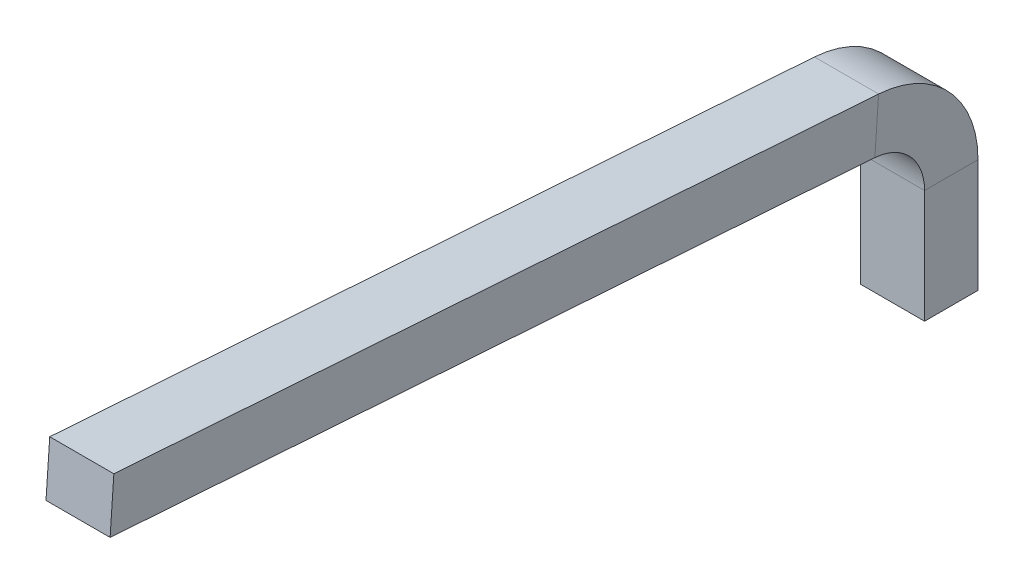
ISO-10303-21;
HEADER;
FILE_DESCRIPTION(('STEP AP214'),'2;1');
FILE_NAME('part.step','',(''),(''),'','','');
FILE_SCHEMA(('AUTOMOTIVE_DESIGN { 1 0 10303 214 1 1 1 1 }'));
ENDSEC;
DATA;
#1=APPLICATION_CONTEXT('core data for automotive mechanical design processes');
#2=APPLICATION_PROTOCOL_DEFINITION('international standard','automotive_design',2000,#1);
#3=PRODUCT_CONTEXT('',#1,'mechanical');
#4=PRODUCT('Part','Part','',(#3));
#5=PRODUCT_RELATED_PRODUCT_CATEGORY('part','',(#4));
#6=PRODUCT_DEFINITION_FORMATION('','',#4);
#7=PRODUCT_DEFINITION_CONTEXT('part definition',#1,'design');
#8=PRODUCT_DEFINITION('design','',#6,#7);
#9=PRODUCT_DEFINITION_SHAPE('','',#8);
#10=(LENGTH_UNIT() NAMED_UNIT(*) SI_UNIT(.MILLI.,.METRE.));
#11=(NAMED_UNIT(*) PLANE_ANGLE_UNIT() SI_UNIT($,.RADIAN.));
#12=(NAMED_UNIT(*) SI_UNIT($,.STERADIAN.) SOLID_ANGLE_UNIT());
#13=UNCERTAINTY_MEASURE_WITH_UNIT(LENGTH_MEASURE(1.E-05),#10,'distance_accuracy_value','');
#14=(GEOMETRIC_REPRESENTATION_CONTEXT(3) GLOBAL_UNCERTAINTY_ASSIGNED_CONTEXT((#13)) GLOBAL_UNIT_ASSIGNED_CONTEXT((#10,
#11,#12)) REPRESENTATION_CONTEXT('',''));
#15=CARTESIAN_POINT('',(0.,0.,0.));
#16=DIRECTION('',(0.,0.,1.));
#17=DIRECTION('',(1.,0.,0.));
#18=AXIS2_PLACEMENT_3D('',#15,#16,#17);
#19=CARTESIAN_POINT('',(0.,0.,0.5));
#20=DIRECTION('',(0.,0.,1.));
#21=DIRECTION('',(1.,0.,0.));
#22=AXIS2_PLACEMENT_3D('',#19,#20,#21);
#23=PLANE('',#22);
#24=DIRECTION('',(0.,-1.,0.));
#25=VECTOR('',#24,1.);
#26=CARTESIAN_POINT('',(3.5997003916458,0.,0.5));
#27=LINE('',#26,#25);
#28=CARTESIAN_POINT('',(3.5997003916458,21.5182796564353,0.5));
#29=VERTEX_POINT('',#28);
#30=CARTESIAN_POINT('',(3.5997003916458,20.4586796564352,0.5));
#31=VERTEX_POINT('',#30);
#32=EDGE_CURVE('E11',#29,#31,#27,.T.);
#33=ORIENTED_EDGE('',*,*,#32,.T.);
#34=DIRECTION('',(1.,0.,0.));
#35=VECTOR('',#34,1.);
#36=CARTESIAN_POINT('',(0.,20.4586796564352,0.5));
#37=LINE('',#36,#35);
#38=CARTESIAN_POINT('',(4.1997003916363,20.4586796564352,0.5));
#39=VERTEX_POINT('',#38);
#40=EDGE_CURVE('E24',#31,#39,#37,.T.);
#41=ORIENTED_EDGE('',*,*,#40,.T.);
#42=DIRECTION('',(0.,1.,0.));
#43=VECTOR('',#42,1.);
#44=CARTESIAN_POINT('',(4.1997003916363,0.,0.5));
#45=LINE('',#44,#43);
#46=CARTESIAN_POINT('',(4.1997003916363,21.5182796564353,0.5));
#47=VERTEX_POINT('',#46);
#48=EDGE_CURVE('E144',#39,#47,#45,.T.);
#49=ORIENTED_EDGE('',*,*,#48,.T.);
#50=DIRECTION('',(-1.,0.,0.));
#51=VECTOR('',#50,1.);
#52=CARTESIAN_POINT('',(0.,21.5182796564353,0.5));
#53=LINE('',#52,#51);
#54=EDGE_CURVE('E142',#47,#29,#53,.T.);
#55=ORIENTED_EDGE('',*,*,#54,.T.);
#56=EDGE_LOOP('',(#33,#41,#49,#55));
#57=FACE_BOUND('',#56,.T.);
#58=ADVANCED_FACE('F17',(#57),#23,.T.);
#59=CARTESIAN_POINT('',(3.5997003916458,0.,0.5));
#60=DIRECTION('',(1.,0.,0.));
#61=DIRECTION('',(0.,1.,0.));
#62=AXIS2_PLACEMENT_3D('',#59,#60,#61);
#63=PLANE('',#62);
#64=DIRECTION('',(0.,0.,-1.));
#65=VECTOR('',#64,1.);
#66=CARTESIAN_POINT('',(3.5997003916458,20.4586796564352,0.5));
#67=LINE('',#66,#65);
#68=CARTESIAN_POINT('',(3.5997003916458,20.4586796564352,0.));
#69=VERTEX_POINT('',#68);
#70=EDGE_CURVE('E140',#31,#69,#67,.T.);
#71=ORIENTED_EDGE('',*,*,#70,.F.);
#72=ORIENTED_EDGE('',*,*,#32,.F.);
#73=DIRECTION('',(0.,0.,1.));
#74=VECTOR('',#73,1.);
#75=CARTESIAN_POINT('',(3.5997003916458,21.5182796564353,0.50000000000015));
#76=LINE('',#75,#74);
#77=CARTESIAN_POINT('',(3.5997003916458,21.5182796564353,0.));
#78=VERTEX_POINT('',#77);
#79=EDGE_CURVE('E137',#78,#29,#76,.T.);
#80=ORIENTED_EDGE('',*,*,#79,.F.);
#81=DIRECTION('',(0.,-1.,0.));
#82=VECTOR('',#81,1.);
#83=CARTESIAN_POINT('',(3.5997003916458,0.,0.));
#84=LINE('',#83,#82);
#85=EDGE_CURVE('E134',#78,#69,#84,.T.);
#86=ORIENTED_EDGE('',*,*,#85,.T.);
#87=EDGE_LOOP('',(#71,#72,#80,#86));
#88=FACE_BOUND('',#87,.T.);
#89=ADVANCED_FACE('F182',(#88),#63,.F.);
#90=CARTESIAN_POINT('',(0.,0.,0.));
#91=DIRECTION('',(0.,0.,1.));
#92=DIRECTION('',(1.,0.,0.));
#93=AXIS2_PLACEMENT_3D('',#90,#91,#92);
#94=PLANE('',#93);
#95=DIRECTION('',(1.,0.,0.));
#96=VECTOR('',#95,1.);
#97=CARTESIAN_POINT('',(0.,20.4586796564352,0.));
#98=LINE('',#97,#96);
#99=CARTESIAN_POINT('',(4.1997003916363,20.4586796564352,0.));
#100=VERTEX_POINT('',#99);
#101=EDGE_CURVE('E132',#69,#100,#98,.T.);
#102=ORIENTED_EDGE('',*,*,#101,.F.);
#103=ORIENTED_EDGE('',*,*,#85,.F.);
#104=DIRECTION('',(-1.,0.,0.));
#105=VECTOR('',#104,1.);
#106=CARTESIAN_POINT('',(0.,21.5182796564353,0.));
#107=LINE('',#106,#105);
#108=CARTESIAN_POINT('',(4.1997003916363,21.5182796564353,0.));
#109=VERTEX_POINT('',#108);
#110=EDGE_CURVE('E129',#109,#78,#107,.T.);
#111=ORIENTED_EDGE('',*,*,#110,.F.);
#112=DIRECTION('',(0.,1.,0.));
#113=VECTOR('',#112,1.);
#114=CARTESIAN_POINT('',(4.1997003916363,0.,0.));
#115=LINE('',#114,#113);
#116=EDGE_CURVE('E126',#100,#109,#115,.T.);
#117=ORIENTED_EDGE('',*,*,#116,.F.);
#118=EDGE_LOOP('',(#102,#103,#111,#117));
#119=FACE_BOUND('',#118,.T.);
#120=ADVANCED_FACE('F158',(#119),#94,.F.);
#121=CARTESIAN_POINT('',(4.1997003916363,0.,0.5));
#122=DIRECTION('',(-1.,0.,0.));
#123=DIRECTION('',(0.,0.,1.));
#124=AXIS2_PLACEMENT_3D('',#121,#122,#123);
#125=PLANE('',#124);
#126=DIRECTION('',(0.,0.,1.));
#127=VECTOR('',#126,1.);
#128=CARTESIAN_POINT('',(4.1997003916363,20.4586796564352,0.5));
#129=LINE('',#128,#127);
#130=EDGE_CURVE('E123',#100,#39,#129,.T.);
#131=ORIENTED_EDGE('',*,*,#130,.F.);
#132=ORIENTED_EDGE('',*,*,#116,.T.);
#133=DIRECTION('',(0.,0.,-1.));
#134=VECTOR('',#133,1.);
#135=CARTESIAN_POINT('',(4.1997003916363,21.5182796564353,0.50000000000015));
#136=LINE('',#135,#134);
#137=EDGE_CURVE('E120',#47,#109,#136,.T.);
#138=ORIENTED_EDGE('',*,*,#137,.F.);
#139=ORIENTED_EDGE('',*,*,#48,.F.);
#140=EDGE_LOOP('',(#131,#132,#138,#139));
#141=FACE_BOUND('',#140,.T.);
#142=ADVANCED_FACE('F151',(#141),#125,.F.);
#143=CARTESIAN_POINT('',(4.1997003916363,20.4374949025711,-21.6237355734576));
#144=DIRECTION('',(-1.,0.,0.));
#145=DIRECTION('',(0.,-0.997564050259825,0.0697564737441219));
#146=AXIS2_PLACEMENT_3D('',#143,#144,#145);
#147=PLANE('',#146);
#148=DIRECTION('',(0.,0.0697564737441219,0.997564050259824));
#149=VECTOR('',#148,1.);
#150=CARTESIAN_POINT('',(4.1997003916363,20.4374949025711,-21.6237355734576));
#151=LINE('',#150,#149);
#152=CARTESIAN_POINT('',(4.1997003916363,22.0170616815652,0.965121763127939));
#153=VERTEX_POINT('',#152);
#154=CARTESIAN_POINT('',(4.1997003916363,22.5175408471448,8.1223072785196));
#155=VERTEX_POINT('',#154);
#156=EDGE_CURVE('E99',#153,#155,#151,.T.);
#157=ORIENTED_EDGE('',*,*,#156,.F.);
#158=DIRECTION('',(0.,0.997564050259825,-0.069756473744115));
#159=VECTOR('',#158,1.);
#160=CARTESIAN_POINT('',(4.1997003916363,22.0170616815651,0.965121763127949));
#161=LINE('',#160,#159);
#162=CARTESIAN_POINT('',(4.1997003916363,22.5158437066951,0.93024352625588));
#163=VERTEX_POINT('',#162);
#164=EDGE_CURVE('E117',#153,#163,#161,.T.);
#165=ORIENTED_EDGE('',*,*,#164,.T.);
#166=DIRECTION('',(0.,0.0697564737441219,0.997564050259824));
#167=VECTOR('',#166,1.);
#168=CARTESIAN_POINT('',(4.1997003916363,20.936276927701,-21.6586138103297));
#169=LINE('',#168,#167);
#170=CARTESIAN_POINT('',(4.1997003916363,23.0163228722747,8.0874290416475));
#171=VERTEX_POINT('',#170);
#172=EDGE_CURVE('E115',#163,#171,#169,.T.);
#173=ORIENTED_EDGE('',*,*,#172,.T.);
#174=DIRECTION('',(0.,0.997564050259824,-0.0697564737441219));
#175=VECTOR('',#174,1.);
#176=CARTESIAN_POINT('',(4.1997003916363,22.5175408471448,8.1223072785196));
#177=LINE('',#176,#175);
#178=EDGE_CURVE('E113',#155,#171,#177,.T.);
#179=ORIENTED_EDGE('',*,*,#178,.F.);
#180=EDGE_LOOP('',(#157,#165,#173,#179));
#181=FACE_BOUND('',#180,.T.);
#182=ADVANCED_FACE('F193',(#181),#147,.F.);
#183=CARTESIAN_POINT('',(3.5997003916458,20.4374949025711,-21.6237355734576));
#184=DIRECTION('',(1.,0.,0.));
#185=DIRECTION('',(0.,0.0697564737441219,0.997564050259825));
#186=AXIS2_PLACEMENT_3D('',#183,#184,#185);
#187=PLANE('',#186);
#188=DIRECTION('',(0.,-0.0697564737441219,-0.997564050259824));
#189=VECTOR('',#188,1.);
#190=CARTESIAN_POINT('',(3.5997003916458,20.936276927701,-21.6586138103297));
#191=LINE('',#190,#189);
#192=CARTESIAN_POINT('',(3.5997003916457,23.0163228722747,8.0874290416475));
#193=VERTEX_POINT('',#192);
#194=CARTESIAN_POINT('',(3.5997003916458,22.5158437066951,0.93024352625588));
#195=VERTEX_POINT('',#194);
#196=EDGE_CURVE('E111',#193,#195,#191,.T.);
#197=ORIENTED_EDGE('',*,*,#196,.T.);
#198=DIRECTION('',(0.,-0.997564050259825,0.069756473744115));
#199=VECTOR('',#198,1.);
#200=CARTESIAN_POINT('',(3.5997003916458,22.0170616815651,0.965121763127949));
#201=LINE('',#200,#199);
#202=CARTESIAN_POINT('',(3.5997003916458,22.0170616815652,0.96512176312794));
#203=VERTEX_POINT('',#202);
#204=EDGE_CURVE('E83',#195,#203,#201,.T.);
#205=ORIENTED_EDGE('',*,*,#204,.T.);
#206=DIRECTION('',(0.,-0.0697564737441219,-0.997564050259824));
#207=VECTOR('',#206,1.);
#208=CARTESIAN_POINT('',(3.5997003916458,20.4374949025711,-21.6237355734576));
#209=LINE('',#208,#207);
#210=CARTESIAN_POINT('',(3.5997003916457,22.5175408471448,8.1223072785196));
#211=VERTEX_POINT('',#210);
#212=EDGE_CURVE('E77',#211,#203,#209,.T.);
#213=ORIENTED_EDGE('',*,*,#212,.F.);
#214=DIRECTION('',(0.,0.997564050259824,-0.0697564737441219));
#215=VECTOR('',#214,1.);
#216=CARTESIAN_POINT('',(3.5997003916457,22.5175408471448,8.1223072785196));
#217=LINE('',#216,#215);
#218=EDGE_CURVE('E80',#211,#193,#217,.T.);
#219=ORIENTED_EDGE('',*,*,#218,.T.);
#220=EDGE_LOOP('',(#197,#205,#213,#219));
#221=FACE_BOUND('',#220,.T.);
#222=ADVANCED_FACE('F79',(#221),#187,.F.);
#223=CARTESIAN_POINT('',(0.,20.936276927701,-21.6586138103297));
#224=DIRECTION('',(0.,-0.997564050259825,0.0697564737441219));
#225=DIRECTION('',(1.,0.,0.));
#226=AXIS2_PLACEMENT_3D('',#223,#224,#225);
#227=PLANE('',#226);
#228=ORIENTED_EDGE('',*,*,#172,.F.);
#229=DIRECTION('',(-1.,0.,0.));
#230=VECTOR('',#229,1.);
#231=CARTESIAN_POINT('',(0.,22.5158437066951,0.93024352625588));
#232=LINE('',#231,#230);
#233=EDGE_CURVE('E96',#163,#195,#232,.T.);
#234=ORIENTED_EDGE('',*,*,#233,.T.);
#235=ORIENTED_EDGE('',*,*,#196,.F.);
#236=DIRECTION('',(1.,0.,0.));
#237=VECTOR('',#236,1.);
#238=CARTESIAN_POINT('',(0.,23.0163228722747,8.0874290416475));
#239=LINE('',#238,#237);
#240=EDGE_CURVE('E95',#193,#171,#239,.T.);
#241=ORIENTED_EDGE('',*,*,#240,.T.);
#242=EDGE_LOOP('',(#228,#234,#235,#241));
#243=FACE_BOUND('',#242,.T.);
#244=ADVANCED_FACE('F199',(#243),#227,.F.);
#245=CARTESIAN_POINT('',(0.,22.5175408471448,8.1223072785196));
#246=DIRECTION('',(0.,0.0697564737441219,0.997564050259825));
#247=DIRECTION('',(0.,-0.997564050259825,0.0697564737441219));
#248=AXIS2_PLACEMENT_3D('',#245,#246,#247);
#249=PLANE('',#248);
#250=ORIENTED_EDGE('',*,*,#240,.F.);
#251=ORIENTED_EDGE('',*,*,#218,.F.);
#252=DIRECTION('',(1.,0.,0.));
#253=VECTOR('',#252,1.);
#254=CARTESIAN_POINT('',(0.,22.5175408471448,8.1223072785196));
#255=LINE('',#254,#253);
#256=EDGE_CURVE('E93',#211,#155,#255,.T.);
#257=ORIENTED_EDGE('',*,*,#256,.T.);
#258=ORIENTED_EDGE('',*,*,#178,.T.);
#259=EDGE_LOOP('',(#250,#251,#257,#258));
#260=FACE_BOUND('',#259,.T.);
#261=ADVANCED_FACE('F91',(#260),#249,.T.);
#262=CARTESIAN_POINT('',(0.,20.4374949025711,-21.6237355734576));
#263=DIRECTION('',(0.,-0.997564050259825,0.0697564737441219));
#264=DIRECTION('',(1.,0.,0.));
#265=AXIS2_PLACEMENT_3D('',#262,#263,#264);
#266=PLANE('',#265);
#267=DIRECTION('',(-1.,0.,0.));
#268=VECTOR('',#267,1.);
#269=CARTESIAN_POINT('',(0.,22.0170616815652,0.965121763127939));
#270=LINE('',#269,#268);
#271=EDGE_CURVE('E101',#153,#203,#270,.T.);
#272=ORIENTED_EDGE('',*,*,#271,.F.);
#273=ORIENTED_EDGE('',*,*,#156,.T.);
#274=ORIENTED_EDGE('',*,*,#256,.F.);
#275=ORIENTED_EDGE('',*,*,#212,.T.);
#276=EDGE_LOOP('',(#272,#273,#274,#275));
#277=FACE_BOUND('',#276,.T.);
#278=ADVANCED_FACE('F98',(#277),#266,.T.);
#279=CARTESIAN_POINT('',(4.1997003916363,21.5182796564353,1.));
#280=DIRECTION('',(-1.,0.,0.));
#281=DIRECTION('',(0.,0.,1.));
#282=AXIS2_PLACEMENT_3D('',#279,#280,#281);
#283=PLANE('',#282);
#284=ORIENTED_EDGE('',*,*,#137,.T.);
#285=CARTESIAN_POINT('',(4.1997003916363,21.5182796564353,1.));
#286=DIRECTION('',(1.,0.,0.));
#287=DIRECTION('',(0.,0.,1.));
#288=AXIS2_PLACEMENT_3D('',#285,#286,#287);
#289=CIRCLE('',#288,1.);
#290=EDGE_CURVE('E104',#109,#163,#289,.T.);
#291=ORIENTED_EDGE('',*,*,#290,.T.);
#292=ORIENTED_EDGE('',*,*,#164,.F.);
#293=CARTESIAN_POINT('',(4.1997003916363,21.5182796564353,1.));
#294=DIRECTION('',(1.,0.,0.));
#295=DIRECTION('',(0.,0.,-1.));
#296=AXIS2_PLACEMENT_3D('',#293,#294,#295);
#297=CIRCLE('',#296,0.5);
#298=EDGE_CURVE('E165',#47,#153,#297,.T.);
#299=ORIENTED_EDGE('',*,*,#298,.F.);
#300=EDGE_LOOP('',(#284,#291,#292,#299));
#301=FACE_BOUND('',#300,.T.);
#302=ADVANCED_FACE('F162',(#301),#283,.F.);
#303=CARTESIAN_POINT('',(3.5997003916458,21.5182796564353,1.));
#304=DIRECTION('',(1.,0.,0.));
#305=DIRECTION('',(0.,0.,-1.));
#306=AXIS2_PLACEMENT_3D('',#303,#304,#305);
#307=PLANE('',#306);
#308=ORIENTED_EDGE('',*,*,#204,.F.);
#309=CARTESIAN_POINT('',(3.5997003916458,21.5182796564353,1.));
#310=DIRECTION('',(-1.,0.,0.));
#311=DIRECTION('',(0.,0.,1.));
#312=AXIS2_PLACEMENT_3D('',#309,#310,#311);
#313=CIRCLE('',#312,1.);
#314=EDGE_CURVE('E171',#195,#78,#313,.T.);
#315=ORIENTED_EDGE('',*,*,#314,.T.);
#316=ORIENTED_EDGE('',*,*,#79,.T.);
#317=CARTESIAN_POINT('',(3.5997003916458,21.5182796564353,1.));
#318=DIRECTION('',(-1.,0.,0.));
#319=DIRECTION('',(0.,0.,1.));
#320=AXIS2_PLACEMENT_3D('',#317,#318,#319);
#321=CIRCLE('',#320,0.5);
#322=EDGE_CURVE('E175',#203,#29,#321,.T.);
#323=ORIENTED_EDGE('',*,*,#322,.F.);
#324=EDGE_LOOP('',(#308,#315,#316,#323));
#325=FACE_BOUND('',#324,.T.);
#326=ADVANCED_FACE('F181',(#325),#307,.F.);
#327=CARTESIAN_POINT('',(5.2698407569527,21.5182796564353,1.));
#328=DIRECTION('',(-1.,0.,0.));
#329=DIRECTION('',(0.,0.,1.));
#330=AXIS2_PLACEMENT_3D('',#327,#328,#329);
#331=CYLINDRICAL_SURFACE('',#330,0.5);
#332=ORIENTED_EDGE('',*,*,#322,.T.);
#333=ORIENTED_EDGE('',*,*,#54,.F.);
#334=ORIENTED_EDGE('',*,*,#298,.T.);
#335=ORIENTED_EDGE('',*,*,#271,.T.);
#336=EDGE_LOOP('',(#332,#333,#334,#335));
#337=FACE_BOUND('',#336,.T.);
#338=ADVANCED_FACE('F179',(#337),#331,.F.);
#339=CARTESIAN_POINT('',(5.2698407569527,21.5182796564353,1.));
#340=DIRECTION('',(-1.,0.,0.));
#341=DIRECTION('',(0.,0.,1.));
#342=AXIS2_PLACEMENT_3D('',#339,#340,#341);
#343=CYLINDRICAL_SURFACE('',#342,1.);
#344=ORIENTED_EDGE('',*,*,#314,.F.);
#345=ORIENTED_EDGE('',*,*,#233,.F.);
#346=ORIENTED_EDGE('',*,*,#290,.F.);
#347=ORIENTED_EDGE('',*,*,#110,.T.);
#348=EDGE_LOOP('',(#344,#345,#346,#347));
#349=FACE_BOUND('',#348,.T.);
#350=ADVANCED_FACE('F169',(#349),#343,.T.);
#351=CARTESIAN_POINT('',(-0.00029960835417188,20.4586796564352,-0.01));
#352=DIRECTION('',(0.,-1.,0.));
#353=DIRECTION('',(0.,0.,-1.));
#354=AXIS2_PLACEMENT_3D('',#351,#352,#353);
#355=PLANE('',#354);
#356=ORIENTED_EDGE('',*,*,#40,.F.);
#357=ORIENTED_EDGE('',*,*,#70,.T.);
#358=ORIENTED_EDGE('',*,*,#101,.T.);
#359=ORIENTED_EDGE('',*,*,#130,.T.);
#360=EDGE_LOOP('',(#356,#357,#358,#359));
#361=FACE_BOUND('',#360,.T.);
#362=ADVANCED_FACE('F153',(#361),#355,.T.);
#363=CLOSED_SHELL('',(#58,#89,#120,#142,#182,#222,#244,#261,#278,#302,#326,#338,#350,#362));
#364=MANIFOLD_SOLID_BREP('B1',#363);
#365=ADVANCED_BREP_SHAPE_REPRESENTATION('',(#18,#364),#14);
#366=SHAPE_DEFINITION_REPRESENTATION(#9,#365);
ENDSEC;
END-ISO-10303-21;
